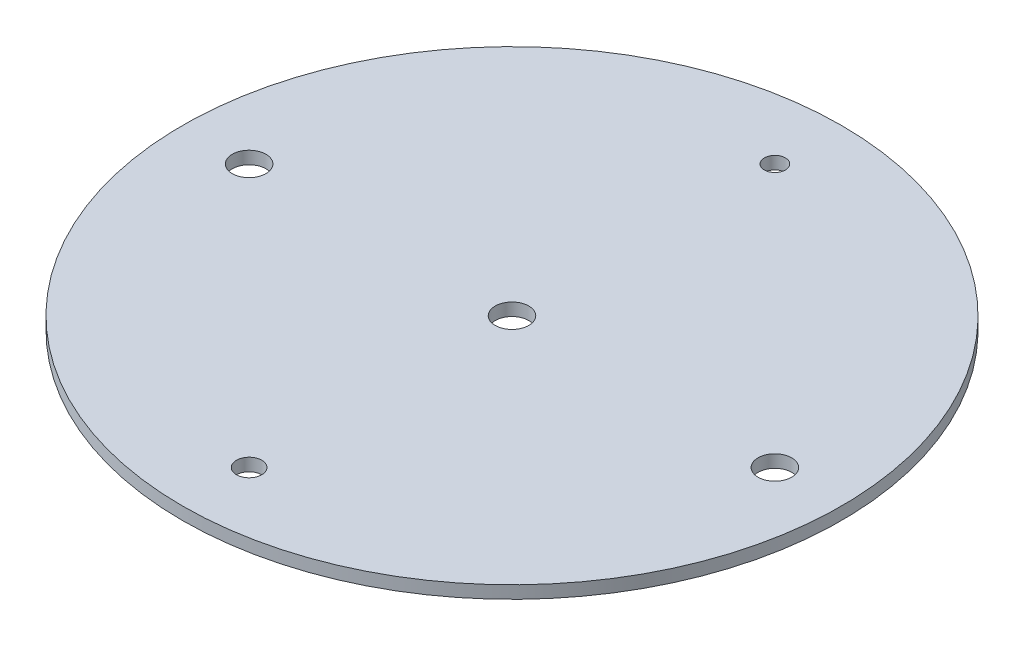
ISO-10303-21;
HEADER;
FILE_DESCRIPTION(('STEP AP214'),'2;1');
FILE_NAME('part.step','',(''),(''),'','','');
FILE_SCHEMA(('AUTOMOTIVE_DESIGN { 1 0 10303 214 1 1 1 1 }'));
ENDSEC;
DATA;
#1=APPLICATION_CONTEXT('core data for automotive mechanical design processes');
#2=APPLICATION_PROTOCOL_DEFINITION('international standard','automotive_design',2000,#1);
#3=PRODUCT_CONTEXT('',#1,'mechanical');
#4=PRODUCT('Part','Part','',(#3));
#5=PRODUCT_RELATED_PRODUCT_CATEGORY('part','',(#4));
#6=PRODUCT_DEFINITION_FORMATION('','',#4);
#7=PRODUCT_DEFINITION_CONTEXT('part definition',#1,'design');
#8=PRODUCT_DEFINITION('design','',#6,#7);
#9=PRODUCT_DEFINITION_SHAPE('','',#8);
#10=(LENGTH_UNIT() NAMED_UNIT(*) SI_UNIT(.MILLI.,.METRE.));
#11=(NAMED_UNIT(*) PLANE_ANGLE_UNIT() SI_UNIT($,.RADIAN.));
#12=(NAMED_UNIT(*) SI_UNIT($,.STERADIAN.) SOLID_ANGLE_UNIT());
#13=UNCERTAINTY_MEASURE_WITH_UNIT(LENGTH_MEASURE(1.E-05),#10,'distance_accuracy_value','');
#14=(GEOMETRIC_REPRESENTATION_CONTEXT(3) GLOBAL_UNCERTAINTY_ASSIGNED_CONTEXT((#13)) GLOBAL_UNIT_ASSIGNED_CONTEXT((#10,
#11,#12)) REPRESENTATION_CONTEXT('',''));
#15=CARTESIAN_POINT('',(0.,0.,0.));
#16=DIRECTION('',(0.,0.,1.));
#17=DIRECTION('',(1.,0.,0.));
#18=AXIS2_PLACEMENT_3D('',#15,#16,#17);
#19=CARTESIAN_POINT('',(0.,3.,0.));
#20=DIRECTION('',(0.,1.,0.));
#21=DIRECTION('',(0.,0.,1.));
#22=AXIS2_PLACEMENT_3D('',#19,#20,#21);
#23=PLANE('',#22);
#24=CARTESIAN_POINT('',(62.5,3.,0.));
#25=DIRECTION('',(0.,1.,0.));
#26=DIRECTION('',(0.,0.,1.));
#27=AXIS2_PLACEMENT_3D('',#24,#25,#26);
#28=CIRCLE('',#27,4.00000000000001);
#29=CARTESIAN_POINT('',(62.5,3.,4.00000000000001));
#30=VERTEX_POINT('',#29);
#31=EDGE_CURVE('E72',#30,#30,#28,.T.);
#32=ORIENTED_EDGE('',*,*,#31,.F.);
#33=EDGE_LOOP('',(#32));
#34=FACE_BOUND('',#33,.T.);
#35=CARTESIAN_POINT('',(0.,3.,62.5));
#36=DIRECTION('',(0.,1.,0.));
#37=DIRECTION('',(0.,0.,1.));
#38=AXIS2_PLACEMENT_3D('',#35,#36,#37);
#39=CIRCLE('',#38,3.);
#40=CARTESIAN_POINT('',(0.,3.,65.5));
#41=VERTEX_POINT('',#40);
#42=EDGE_CURVE('E56',#41,#41,#39,.T.);
#43=ORIENTED_EDGE('',*,*,#42,.F.);
#44=EDGE_LOOP('',(#43));
#45=FACE_BOUND('',#44,.T.);
#46=CARTESIAN_POINT('',(0.,3.,0.));
#47=DIRECTION('',(0.,1.,0.));
#48=DIRECTION('',(0.,0.,1.));
#49=AXIS2_PLACEMENT_3D('',#46,#47,#48);
#50=CIRCLE('',#49,78.35);
#51=CARTESIAN_POINT('',(0.,3.,78.35));
#52=VERTEX_POINT('',#51);
#53=EDGE_CURVE('E10',#52,#52,#50,.T.);
#54=ORIENTED_EDGE('',*,*,#53,.T.);
#55=EDGE_LOOP('',(#54));
#56=FACE_BOUND('',#55,.T.);
#57=CARTESIAN_POINT('',(-62.5,3.,0.));
#58=DIRECTION('',(0.,1.,0.));
#59=DIRECTION('',(0.,0.,1.));
#60=AXIS2_PLACEMENT_3D('',#57,#58,#59);
#61=CIRCLE('',#60,4.00000000000001);
#62=CARTESIAN_POINT('',(-62.5,3.,4.00000000000001));
#63=VERTEX_POINT('',#62);
#64=EDGE_CURVE('E50',#63,#63,#61,.T.);
#65=ORIENTED_EDGE('',*,*,#64,.F.);
#66=EDGE_LOOP('',(#65));
#67=FACE_BOUND('',#66,.T.);
#68=CARTESIAN_POINT('',(0.,3.,-62.5));
#69=DIRECTION('',(0.,1.,0.));
#70=DIRECTION('',(0.,0.,1.));
#71=AXIS2_PLACEMENT_3D('',#68,#69,#70);
#72=CIRCLE('',#71,2.5);
#73=CARTESIAN_POINT('',(0.,3.,-60.));
#74=VERTEX_POINT('',#73);
#75=EDGE_CURVE('E64',#74,#74,#72,.T.);
#76=ORIENTED_EDGE('',*,*,#75,.F.);
#77=EDGE_LOOP('',(#76));
#78=FACE_BOUND('',#77,.T.);
#79=CARTESIAN_POINT('',(0.,3.,0.));
#80=DIRECTION('',(0.,1.,0.));
#81=DIRECTION('',(0.,0.,1.));
#82=AXIS2_PLACEMENT_3D('',#79,#80,#81);
#83=CIRCLE('',#82,4.);
#84=CARTESIAN_POINT('',(0.,3.,4.));
#85=VERTEX_POINT('',#84);
#86=EDGE_CURVE('E80',#85,#85,#83,.T.);
#87=ORIENTED_EDGE('',*,*,#86,.F.);
#88=EDGE_LOOP('',(#87));
#89=FACE_BOUND('',#88,.T.);
#90=ADVANCED_FACE('F37',(#34,#45,#56,#67,#78,#89),#23,.T.);
#91=CARTESIAN_POINT('',(0.,0.,0.));
#92=DIRECTION('',(0.,1.,0.));
#93=DIRECTION('',(0.,0.,1.));
#94=AXIS2_PLACEMENT_3D('',#91,#92,#93);
#95=PLANE('',#94);
#96=CARTESIAN_POINT('',(0.,0.,0.));
#97=DIRECTION('',(0.,1.,0.));
#98=DIRECTION('',(0.,0.,1.));
#99=AXIS2_PLACEMENT_3D('',#96,#97,#98);
#100=CIRCLE('',#99,78.35);
#101=CARTESIAN_POINT('',(0.,0.,78.35));
#102=VERTEX_POINT('',#101);
#103=EDGE_CURVE('E41',#102,#102,#100,.T.);
#104=ORIENTED_EDGE('',*,*,#103,.F.);
#105=EDGE_LOOP('',(#104));
#106=FACE_BOUND('',#105,.T.);
#107=CARTESIAN_POINT('',(-62.5,0.,0.));
#108=DIRECTION('',(0.,1.,0.));
#109=DIRECTION('',(0.,0.,1.));
#110=AXIS2_PLACEMENT_3D('',#107,#108,#109);
#111=CIRCLE('',#110,4.00000000000001);
#112=CARTESIAN_POINT('',(-62.5,0.,4.00000000000001));
#113=VERTEX_POINT('',#112);
#114=EDGE_CURVE('E52',#113,#113,#111,.T.);
#115=ORIENTED_EDGE('',*,*,#114,.T.);
#116=EDGE_LOOP('',(#115));
#117=FACE_BOUND('',#116,.T.);
#118=CARTESIAN_POINT('',(0.,0.,62.5));
#119=DIRECTION('',(0.,1.,0.));
#120=DIRECTION('',(0.,0.,1.));
#121=AXIS2_PLACEMENT_3D('',#118,#119,#120);
#122=CIRCLE('',#121,3.);
#123=CARTESIAN_POINT('',(0.,0.,65.5));
#124=VERTEX_POINT('',#123);
#125=EDGE_CURVE('E60',#124,#124,#122,.T.);
#126=ORIENTED_EDGE('',*,*,#125,.T.);
#127=EDGE_LOOP('',(#126));
#128=FACE_BOUND('',#127,.T.);
#129=CARTESIAN_POINT('',(0.,0.,-62.5));
#130=DIRECTION('',(0.,1.,0.));
#131=DIRECTION('',(0.,0.,1.));
#132=AXIS2_PLACEMENT_3D('',#129,#130,#131);
#133=CIRCLE('',#132,2.5);
#134=CARTESIAN_POINT('',(0.,0.,-60.));
#135=VERTEX_POINT('',#134);
#136=EDGE_CURVE('E68',#135,#135,#133,.T.);
#137=ORIENTED_EDGE('',*,*,#136,.T.);
#138=EDGE_LOOP('',(#137));
#139=FACE_BOUND('',#138,.T.);
#140=CARTESIAN_POINT('',(62.5,0.,0.));
#141=DIRECTION('',(0.,1.,0.));
#142=DIRECTION('',(0.,0.,1.));
#143=AXIS2_PLACEMENT_3D('',#140,#141,#142);
#144=CIRCLE('',#143,4.00000000000001);
#145=CARTESIAN_POINT('',(62.5,0.,4.00000000000001));
#146=VERTEX_POINT('',#145);
#147=EDGE_CURVE('E76',#146,#146,#144,.T.);
#148=ORIENTED_EDGE('',*,*,#147,.T.);
#149=EDGE_LOOP('',(#148));
#150=FACE_BOUND('',#149,.T.);
#151=CARTESIAN_POINT('',(0.,0.,0.));
#152=DIRECTION('',(0.,1.,0.));
#153=DIRECTION('',(0.,0.,1.));
#154=AXIS2_PLACEMENT_3D('',#151,#152,#153);
#155=CIRCLE('',#154,4.);
#156=CARTESIAN_POINT('',(0.,0.,4.));
#157=VERTEX_POINT('',#156);
#158=EDGE_CURVE('E84',#157,#157,#155,.T.);
#159=ORIENTED_EDGE('',*,*,#158,.T.);
#160=EDGE_LOOP('',(#159));
#161=FACE_BOUND('',#160,.T.);
#162=ADVANCED_FACE('F96',(#106,#117,#128,#139,#150,#161),#95,.F.);
#163=CARTESIAN_POINT('',(0.,3.,0.));
#164=DIRECTION('',(0.,-1.,0.));
#165=DIRECTION('',(0.,0.,-1.));
#166=AXIS2_PLACEMENT_3D('',#163,#164,#165);
#167=CYLINDRICAL_SURFACE('',#166,78.35);
#168=ORIENTED_EDGE('',*,*,#53,.F.);
#169=EDGE_LOOP('',(#168));
#170=FACE_BOUND('',#169,.T.);
#171=ORIENTED_EDGE('',*,*,#103,.T.);
#172=EDGE_LOOP('',(#171));
#173=FACE_BOUND('',#172,.T.);
#174=ADVANCED_FACE('F39',(#170,#173),#167,.T.);
#175=CARTESIAN_POINT('',(-62.5,3.,0.));
#176=DIRECTION('',(0.,-1.,0.));
#177=DIRECTION('',(0.,0.,-1.));
#178=AXIS2_PLACEMENT_3D('',#175,#176,#177);
#179=CYLINDRICAL_SURFACE('',#178,4.00000000000001);
#180=ORIENTED_EDGE('',*,*,#64,.T.);
#181=EDGE_LOOP('',(#180));
#182=FACE_BOUND('',#181,.T.);
#183=ORIENTED_EDGE('',*,*,#114,.F.);
#184=EDGE_LOOP('',(#183));
#185=FACE_BOUND('',#184,.T.);
#186=ADVANCED_FACE('F106',(#182,#185),#179,.F.);
#187=CARTESIAN_POINT('',(0.,3.,62.5));
#188=DIRECTION('',(0.,-1.,0.));
#189=DIRECTION('',(0.,0.,-1.));
#190=AXIS2_PLACEMENT_3D('',#187,#188,#189);
#191=CYLINDRICAL_SURFACE('',#190,3.);
#192=ORIENTED_EDGE('',*,*,#42,.T.);
#193=EDGE_LOOP('',(#192));
#194=FACE_BOUND('',#193,.T.);
#195=ORIENTED_EDGE('',*,*,#125,.F.);
#196=EDGE_LOOP('',(#195));
#197=FACE_BOUND('',#196,.T.);
#198=ADVANCED_FACE('F109',(#194,#197),#191,.F.);
#199=CARTESIAN_POINT('',(0.,3.,-62.5));
#200=DIRECTION('',(0.,-1.,0.));
#201=DIRECTION('',(0.,0.,-1.));
#202=AXIS2_PLACEMENT_3D('',#199,#200,#201);
#203=CYLINDRICAL_SURFACE('',#202,2.5);
#204=ORIENTED_EDGE('',*,*,#75,.T.);
#205=EDGE_LOOP('',(#204));
#206=FACE_BOUND('',#205,.T.);
#207=ORIENTED_EDGE('',*,*,#136,.F.);
#208=EDGE_LOOP('',(#207));
#209=FACE_BOUND('',#208,.T.);
#210=ADVANCED_FACE('F113',(#206,#209),#203,.F.);
#211=CARTESIAN_POINT('',(62.5,3.,0.));
#212=DIRECTION('',(0.,-1.,0.));
#213=DIRECTION('',(0.,0.,-1.));
#214=AXIS2_PLACEMENT_3D('',#211,#212,#213);
#215=CYLINDRICAL_SURFACE('',#214,4.00000000000001);
#216=ORIENTED_EDGE('',*,*,#31,.T.);
#217=EDGE_LOOP('',(#216));
#218=FACE_BOUND('',#217,.T.);
#219=ORIENTED_EDGE('',*,*,#147,.F.);
#220=EDGE_LOOP('',(#219));
#221=FACE_BOUND('',#220,.T.);
#222=ADVANCED_FACE('F117',(#218,#221),#215,.F.);
#223=CARTESIAN_POINT('',(0.,3.,0.));
#224=DIRECTION('',(0.,-1.,0.));
#225=DIRECTION('',(0.,0.,-1.));
#226=AXIS2_PLACEMENT_3D('',#223,#224,#225);
#227=CYLINDRICAL_SURFACE('',#226,4.);
#228=ORIENTED_EDGE('',*,*,#86,.T.);
#229=EDGE_LOOP('',(#228));
#230=FACE_BOUND('',#229,.T.);
#231=ORIENTED_EDGE('',*,*,#158,.F.);
#232=EDGE_LOOP('',(#231));
#233=FACE_BOUND('',#232,.T.);
#234=ADVANCED_FACE('F92',(#230,#233),#227,.F.);
#235=CLOSED_SHELL('',(#90,#162,#174,#186,#198,#210,#222,#234));
#236=MANIFOLD_SOLID_BREP('B2',#235);
#237=ADVANCED_BREP_SHAPE_REPRESENTATION('',(#18,#236),#14);
#238=SHAPE_DEFINITION_REPRESENTATION(#9,#237);
ENDSEC;
END-ISO-10303-21;
